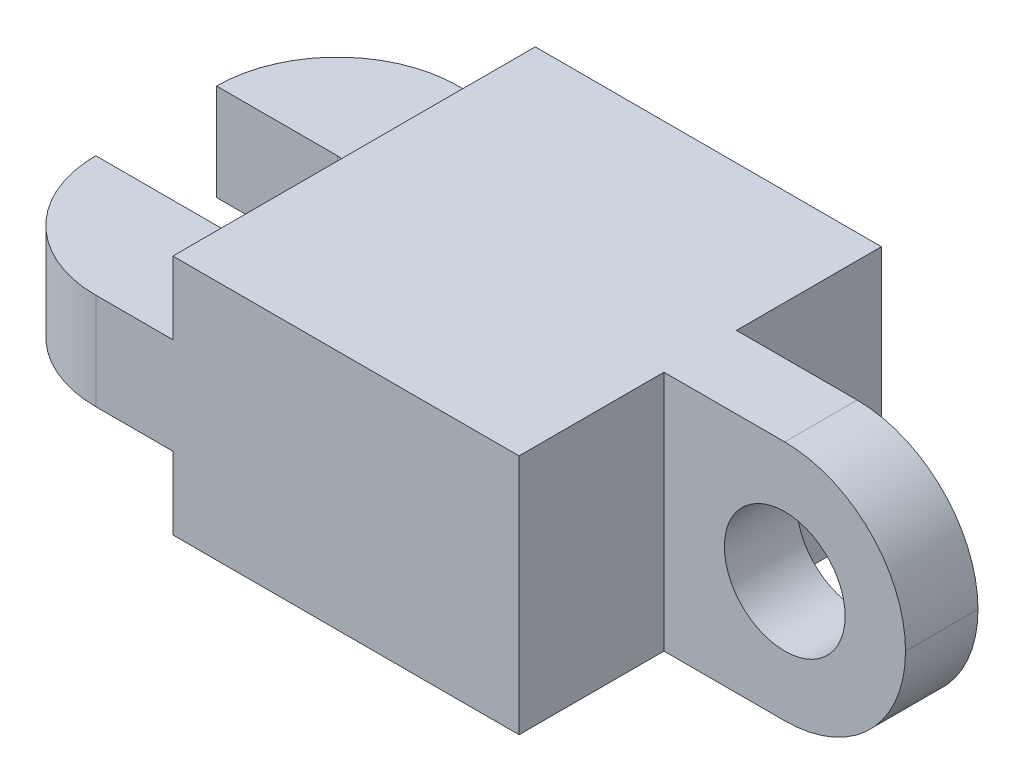
ISO-10303-21;
HEADER;
FILE_DESCRIPTION(('STEP AP214'),'2;1');
FILE_NAME('part.step','',(''),(''),'','','');
FILE_SCHEMA(('AUTOMOTIVE_DESIGN { 1 0 10303 214 1 1 1 1 }'));
ENDSEC;
DATA;
#1=APPLICATION_CONTEXT('core data for automotive mechanical design processes');
#2=APPLICATION_PROTOCOL_DEFINITION('international standard','automotive_design',2000,#1);
#3=PRODUCT_CONTEXT('',#1,'mechanical');
#4=PRODUCT('Part','Part','',(#3));
#5=PRODUCT_RELATED_PRODUCT_CATEGORY('part','',(#4));
#6=PRODUCT_DEFINITION_FORMATION('','',#4);
#7=PRODUCT_DEFINITION_CONTEXT('part definition',#1,'design');
#8=PRODUCT_DEFINITION('design','',#6,#7);
#9=PRODUCT_DEFINITION_SHAPE('','',#8);
#10=(LENGTH_UNIT() NAMED_UNIT(*) SI_UNIT(.MILLI.,.METRE.));
#11=(NAMED_UNIT(*) PLANE_ANGLE_UNIT() SI_UNIT($,.RADIAN.));
#12=(NAMED_UNIT(*) SI_UNIT($,.STERADIAN.) SOLID_ANGLE_UNIT());
#13=UNCERTAINTY_MEASURE_WITH_UNIT(LENGTH_MEASURE(1.E-05),#10,'distance_accuracy_value','');
#14=(GEOMETRIC_REPRESENTATION_CONTEXT(3) GLOBAL_UNCERTAINTY_ASSIGNED_CONTEXT((#13)) GLOBAL_UNIT_ASSIGNED_CONTEXT((#10,
#11,#12)) REPRESENTATION_CONTEXT('',''));
#15=CARTESIAN_POINT('',(0.,0.,0.));
#16=DIRECTION('',(0.,0.,1.));
#17=DIRECTION('',(1.,0.,0.));
#18=AXIS2_PLACEMENT_3D('',#15,#16,#17);
#19=CARTESIAN_POINT('',(0.,-50.,25.));
#20=DIRECTION('',(0.,1.,0.));
#21=DIRECTION('',(0.,0.,1.));
#22=AXIS2_PLACEMENT_3D('',#19,#20,#21);
#23=CYLINDRICAL_SURFACE('',#22,50.);
#24=DIRECTION('',(0.,1.,0.));
#25=VECTOR('',#24,1.);
#26=CARTESIAN_POINT('',(0.,-50.,75.));
#27=LINE('',#26,#25);
#28=CARTESIAN_POINT('',(0.,-20.,75.));
#29=VERTEX_POINT('',#28);
#30=CARTESIAN_POINT('',(0.,20.,75.));
#31=VERTEX_POINT('',#30);
#32=EDGE_CURVE('E300',#29,#31,#27,.T.);
#33=ORIENTED_EDGE('',*,*,#32,.T.);
#34=CARTESIAN_POINT('',(0.,20.,25.));
#35=DIRECTION('',(0.,1.,0.));
#36=DIRECTION('',(-1.,0.,0.));
#37=AXIS2_PLACEMENT_3D('',#34,#35,#36);
#38=CIRCLE('',#37,50.);
#39=CARTESIAN_POINT('',(-50.,20.,25.));
#40=VERTEX_POINT('',#39);
#41=EDGE_CURVE('E178',#31,#40,#38,.F.);
#42=ORIENTED_EDGE('',*,*,#41,.T.);
#43=DIRECTION('',(0.,1.,0.));
#44=VECTOR('',#43,1.);
#45=CARTESIAN_POINT('',(-50.,-50.,25.));
#46=LINE('',#45,#44);
#47=CARTESIAN_POINT('',(-50.,-20.,25.));
#48=VERTEX_POINT('',#47);
#49=EDGE_CURVE('E301',#48,#40,#46,.T.);
#50=ORIENTED_EDGE('',*,*,#49,.F.);
#51=CARTESIAN_POINT('',(0.,-20.,25.));
#52=DIRECTION('',(0.,-1.,0.));
#53=DIRECTION('',(1.,0.,0.));
#54=AXIS2_PLACEMENT_3D('',#51,#52,#53);
#55=CIRCLE('',#54,50.);
#56=EDGE_CURVE('E235',#48,#29,#55,.F.);
#57=ORIENTED_EDGE('',*,*,#56,.T.);
#58=EDGE_LOOP('',(#33,#42,#50,#57));
#59=FACE_BOUND('',#58,.T.);
#60=ADVANCED_FACE('F45',(#59),#23,.T.);
#61=CARTESIAN_POINT('',(-50.,-50.,25.));
#62=DIRECTION('',(0.,0.,-1.));
#63=DIRECTION('',(-1.,0.,0.));
#64=AXIS2_PLACEMENT_3D('',#61,#62,#63);
#65=PLANE('',#64);
#66=ORIENTED_EDGE('',*,*,#49,.T.);
#67=DIRECTION('',(1.,0.,0.));
#68=VECTOR('',#67,1.);
#69=CARTESIAN_POINT('',(-50.,20.,25.));
#70=LINE('',#69,#68);
#71=CARTESIAN_POINT('',(0.,20.,25.));
#72=VERTEX_POINT('',#71);
#73=EDGE_CURVE('E251',#40,#72,#70,.T.);
#74=ORIENTED_EDGE('',*,*,#73,.T.);
#75=DIRECTION('',(0.,1.,0.));
#76=VECTOR('',#75,1.);
#77=CARTESIAN_POINT('',(0.,-50.,25.));
#78=LINE('',#77,#76);
#79=CARTESIAN_POINT('',(0.,-20.,25.));
#80=VERTEX_POINT('',#79);
#81=EDGE_CURVE('E306',#80,#72,#78,.T.);
#82=ORIENTED_EDGE('',*,*,#81,.F.);
#83=DIRECTION('',(-1.,0.,0.));
#84=VECTOR('',#83,1.);
#85=CARTESIAN_POINT('',(-50.,-20.,25.));
#86=LINE('',#85,#84);
#87=EDGE_CURVE('E231',#80,#48,#86,.T.);
#88=ORIENTED_EDGE('',*,*,#87,.T.);
#89=EDGE_LOOP('',(#66,#74,#82,#88));
#90=FACE_BOUND('',#89,.T.);
#91=ADVANCED_FACE('F402',(#90),#65,.T.);
#92=CARTESIAN_POINT('',(0.,-50.,0.));
#93=DIRECTION('',(0.,1.,0.));
#94=DIRECTION('',(0.,0.,1.));
#95=AXIS2_PLACEMENT_3D('',#92,#93,#94);
#96=CYLINDRICAL_SURFACE('',#95,25.);
#97=ORIENTED_EDGE('',*,*,#81,.T.);
#98=CARTESIAN_POINT('',(0.,20.,0.));
#99=DIRECTION('',(0.,1.,0.));
#100=DIRECTION('',(-1.,0.,0.));
#101=AXIS2_PLACEMENT_3D('',#98,#99,#100);
#102=CIRCLE('',#101,25.);
#103=CARTESIAN_POINT('',(0.,20.,-25.));
#104=VERTEX_POINT('',#103);
#105=EDGE_CURVE('E247',#72,#104,#102,.T.);
#106=ORIENTED_EDGE('',*,*,#105,.T.);
#107=DIRECTION('',(0.,1.,0.));
#108=VECTOR('',#107,1.);
#109=CARTESIAN_POINT('',(0.,-50.,-25.));
#110=LINE('',#109,#108);
#111=CARTESIAN_POINT('',(0.,-20.,-25.));
#112=VERTEX_POINT('',#111);
#113=EDGE_CURVE('E310',#112,#104,#110,.T.);
#114=ORIENTED_EDGE('',*,*,#113,.F.);
#115=CARTESIAN_POINT('',(0.,-20.,0.));
#116=DIRECTION('',(0.,-1.,0.));
#117=DIRECTION('',(1.,0.,0.));
#118=AXIS2_PLACEMENT_3D('',#115,#116,#117);
#119=CIRCLE('',#118,25.);
#120=EDGE_CURVE('E227',#112,#80,#119,.T.);
#121=ORIENTED_EDGE('',*,*,#120,.T.);
#122=EDGE_LOOP('',(#97,#106,#114,#121));
#123=FACE_BOUND('',#122,.T.);
#124=ADVANCED_FACE('F399',(#123),#96,.F.);
#125=CARTESIAN_POINT('',(0.,-50.,-25.));
#126=DIRECTION('',(0.,0.,1.));
#127=DIRECTION('',(1.,0.,0.));
#128=AXIS2_PLACEMENT_3D('',#125,#126,#127);
#129=PLANE('',#128);
#130=ORIENTED_EDGE('',*,*,#113,.T.);
#131=DIRECTION('',(-1.,0.,0.));
#132=VECTOR('',#131,1.);
#133=CARTESIAN_POINT('',(0.,20.,-25.));
#134=LINE('',#133,#132);
#135=CARTESIAN_POINT('',(-50.,20.,-25.));
#136=VERTEX_POINT('',#135);
#137=EDGE_CURVE('E243',#104,#136,#134,.T.);
#138=ORIENTED_EDGE('',*,*,#137,.T.);
#139=DIRECTION('',(0.,1.,0.));
#140=VECTOR('',#139,1.);
#141=CARTESIAN_POINT('',(-50.,-50.,-25.));
#142=LINE('',#141,#140);
#143=CARTESIAN_POINT('',(-50.,-20.,-25.));
#144=VERTEX_POINT('',#143);
#145=EDGE_CURVE('E314',#144,#136,#142,.T.);
#146=ORIENTED_EDGE('',*,*,#145,.F.);
#147=DIRECTION('',(1.,0.,0.));
#148=VECTOR('',#147,1.);
#149=CARTESIAN_POINT('',(0.,-20.,-25.));
#150=LINE('',#149,#148);
#151=EDGE_CURVE('E223',#144,#112,#150,.T.);
#152=ORIENTED_EDGE('',*,*,#151,.T.);
#153=EDGE_LOOP('',(#130,#138,#146,#152));
#154=FACE_BOUND('',#153,.T.);
#155=ADVANCED_FACE('F396',(#154),#129,.T.);
#156=CARTESIAN_POINT('',(0.,-50.,-25.));
#157=DIRECTION('',(0.,1.,0.));
#158=DIRECTION('',(0.,0.,1.));
#159=AXIS2_PLACEMENT_3D('',#156,#157,#158);
#160=CYLINDRICAL_SURFACE('',#159,50.);
#161=ORIENTED_EDGE('',*,*,#145,.T.);
#162=CARTESIAN_POINT('',(0.,20.,-25.));
#163=DIRECTION('',(0.,1.,0.));
#164=DIRECTION('',(-1.,0.,0.));
#165=AXIS2_PLACEMENT_3D('',#162,#163,#164);
#166=CIRCLE('',#165,50.);
#167=CARTESIAN_POINT('',(0.,20.,-75.));
#168=VERTEX_POINT('',#167);
#169=EDGE_CURVE('E239',#136,#168,#166,.F.);
#170=ORIENTED_EDGE('',*,*,#169,.T.);
#171=DIRECTION('',(0.,1.,0.));
#172=VECTOR('',#171,1.);
#173=CARTESIAN_POINT('',(0.,-50.,-75.));
#174=LINE('',#173,#172);
#175=CARTESIAN_POINT('',(0.,-20.,-75.));
#176=VERTEX_POINT('',#175);
#177=EDGE_CURVE('E318',#176,#168,#174,.T.);
#178=ORIENTED_EDGE('',*,*,#177,.F.);
#179=CARTESIAN_POINT('',(0.,-20.,-25.));
#180=DIRECTION('',(0.,-1.,0.));
#181=DIRECTION('',(1.,0.,0.));
#182=AXIS2_PLACEMENT_3D('',#179,#180,#181);
#183=CIRCLE('',#182,50.);
#184=EDGE_CURVE('E200',#176,#144,#183,.F.);
#185=ORIENTED_EDGE('',*,*,#184,.T.);
#186=EDGE_LOOP('',(#161,#170,#178,#185));
#187=FACE_BOUND('',#186,.T.);
#188=ADVANCED_FACE('F393',(#187),#160,.T.);
#189=CARTESIAN_POINT('',(0.,-50.,-75.));
#190=DIRECTION('',(0.,0.,-1.));
#191=DIRECTION('',(-1.,0.,0.));
#192=AXIS2_PLACEMENT_3D('',#189,#190,#191);
#193=PLANE('',#192);
#194=ORIENTED_EDGE('',*,*,#177,.T.);
#195=DIRECTION('',(-1.,0.,0.));
#196=VECTOR('',#195,1.);
#197=CARTESIAN_POINT('',(0.,20.,-75.));
#198=LINE('',#197,#196);
#199=CARTESIAN_POINT('',(31.9199581451702,20.,-75.));
#200=VERTEX_POINT('',#199);
#201=EDGE_CURVE('E190',#200,#168,#198,.T.);
#202=ORIENTED_EDGE('',*,*,#201,.F.);
#203=DIRECTION('',(0.,-1.,0.));
#204=VECTOR('',#203,1.);
#205=CARTESIAN_POINT('',(31.9199581451702,50.,-75.));
#206=LINE('',#205,#204);
#207=CARTESIAN_POINT('',(31.9199581451702,50.,-75.));
#208=VERTEX_POINT('',#207);
#209=EDGE_CURVE('E168',#208,#200,#206,.T.);
#210=ORIENTED_EDGE('',*,*,#209,.F.);
#211=DIRECTION('',(-1.,0.,0.));
#212=VECTOR('',#211,1.);
#213=CARTESIAN_POINT('',(0.,50.,-75.));
#214=LINE('',#213,#212);
#215=CARTESIAN_POINT('',(175.21995814517,50.,-75.));
#216=VERTEX_POINT('',#215);
#217=EDGE_CURVE('E274',#216,#208,#214,.T.);
#218=ORIENTED_EDGE('',*,*,#217,.F.);
#219=DIRECTION('',(0.,1.,0.));
#220=VECTOR('',#219,1.);
#221=CARTESIAN_POINT('',(175.21995814517,-50.,-75.));
#222=LINE('',#221,#220);
#223=CARTESIAN_POINT('',(175.21995814517,-50.,-75.));
#224=VERTEX_POINT('',#223);
#225=EDGE_CURVE('E322',#224,#216,#222,.T.);
#226=ORIENTED_EDGE('',*,*,#225,.F.);
#227=DIRECTION('',(-1.,0.,0.));
#228=VECTOR('',#227,1.);
#229=CARTESIAN_POINT('',(0.,-50.,-75.));
#230=LINE('',#229,#228);
#231=CARTESIAN_POINT('',(31.9199581451702,-50.,-75.));
#232=VERTEX_POINT('',#231);
#233=EDGE_CURVE('E296',#224,#232,#230,.T.);
#234=ORIENTED_EDGE('',*,*,#233,.T.);
#235=DIRECTION('',(0.,-1.,0.));
#236=VECTOR('',#235,1.);
#237=CARTESIAN_POINT('',(31.9199581451702,-20.,-75.));
#238=LINE('',#237,#236);
#239=CARTESIAN_POINT('',(31.9199581451702,-20.,-75.));
#240=VERTEX_POINT('',#239);
#241=EDGE_CURVE('E62',#240,#232,#238,.T.);
#242=ORIENTED_EDGE('',*,*,#241,.F.);
#243=DIRECTION('',(1.,0.,0.));
#244=VECTOR('',#243,1.);
#245=CARTESIAN_POINT('',(0.,-20.,-75.));
#246=LINE('',#245,#244);
#247=EDGE_CURVE('E210',#176,#240,#246,.T.);
#248=ORIENTED_EDGE('',*,*,#247,.F.);
#249=EDGE_LOOP('',(#194,#202,#210,#218,#226,#234,#242,#248));
#250=FACE_BOUND('',#249,.T.);
#251=ADVANCED_FACE('F385',(#250),#193,.T.);
#252=CARTESIAN_POINT('',(175.21995814517,-50.,75.));
#253=DIRECTION('',(0.,0.,1.));
#254=DIRECTION('',(1.,0.,0.));
#255=AXIS2_PLACEMENT_3D('',#252,#253,#254);
#256=PLANE('',#255);
#257=DIRECTION('',(0.,-1.,0.));
#258=VECTOR('',#257,1.);
#259=CARTESIAN_POINT('',(31.9199581451702,50.,75.));
#260=LINE('',#259,#258);
#261=CARTESIAN_POINT('',(31.9199581451702,50.,75.));
#262=VERTEX_POINT('',#261);
#263=CARTESIAN_POINT('',(31.9199581451702,20.,75.));
#264=VERTEX_POINT('',#263);
#265=EDGE_CURVE('E70',#262,#264,#260,.T.);
#266=ORIENTED_EDGE('',*,*,#265,.T.);
#267=DIRECTION('',(-1.,0.,0.));
#268=VECTOR('',#267,1.);
#269=CARTESIAN_POINT('',(0.,20.,75.));
#270=LINE('',#269,#268);
#271=EDGE_CURVE('E175',#264,#31,#270,.T.);
#272=ORIENTED_EDGE('',*,*,#271,.T.);
#273=ORIENTED_EDGE('',*,*,#32,.F.);
#274=DIRECTION('',(1.,0.,0.));
#275=VECTOR('',#274,1.);
#276=CARTESIAN_POINT('',(0.,-20.,75.));
#277=LINE('',#276,#275);
#278=CARTESIAN_POINT('',(31.9199581451702,-20.,75.));
#279=VERTEX_POINT('',#278);
#280=EDGE_CURVE('E183',#29,#279,#277,.T.);
#281=ORIENTED_EDGE('',*,*,#280,.T.);
#282=DIRECTION('',(0.,-1.,0.));
#283=VECTOR('',#282,1.);
#284=CARTESIAN_POINT('',(31.9199581451702,-20.,75.));
#285=LINE('',#284,#283);
#286=CARTESIAN_POINT('',(31.9199581451701,-50.,75.));
#287=VERTEX_POINT('',#286);
#288=EDGE_CURVE('E213',#279,#287,#285,.T.);
#289=ORIENTED_EDGE('',*,*,#288,.T.);
#290=DIRECTION('',(1.,0.,0.));
#291=VECTOR('',#290,1.);
#292=CARTESIAN_POINT('',(175.21995814517,-50.,75.));
#293=LINE('',#292,#291);
#294=CARTESIAN_POINT('',(175.21995814517,-50.,75.));
#295=VERTEX_POINT('',#294);
#296=EDGE_CURVE('E278',#287,#295,#293,.T.);
#297=ORIENTED_EDGE('',*,*,#296,.T.);
#298=DIRECTION('',(0.,1.,0.));
#299=VECTOR('',#298,1.);
#300=CARTESIAN_POINT('',(175.21995814517,-50.,75.));
#301=LINE('',#300,#299);
#302=CARTESIAN_POINT('',(175.21995814517,50.,75.));
#303=VERTEX_POINT('',#302);
#304=EDGE_CURVE('E332',#295,#303,#301,.T.);
#305=ORIENTED_EDGE('',*,*,#304,.T.);
#306=DIRECTION('',(1.,0.,0.));
#307=VECTOR('',#306,1.);
#308=CARTESIAN_POINT('',(175.21995814517,50.,75.));
#309=LINE('',#308,#307);
#310=EDGE_CURVE('E188',#262,#303,#309,.T.);
#311=ORIENTED_EDGE('',*,*,#310,.F.);
#312=EDGE_LOOP('',(#266,#272,#273,#281,#289,#297,#305,#311));
#313=FACE_BOUND('',#312,.T.);
#314=ADVANCED_FACE('F186',(#313),#256,.T.);
#315=CARTESIAN_POINT('',(0.,-50.,25.));
#316=DIRECTION('',(0.,-1.,0.));
#317=DIRECTION('',(0.,0.,-1.));
#318=AXIS2_PLACEMENT_3D('',#315,#316,#317);
#319=PLANE('',#318);
#320=ORIENTED_EDGE('',*,*,#296,.F.);
#321=DIRECTION('',(0.,0.,1.));
#322=VECTOR('',#321,1.);
#323=CARTESIAN_POINT('',(31.9199581451701,-50.,-75.));
#324=LINE('',#323,#322);
#325=EDGE_CURVE('E204',#232,#287,#324,.T.);
#326=ORIENTED_EDGE('',*,*,#325,.F.);
#327=ORIENTED_EDGE('',*,*,#233,.F.);
#328=DIRECTION('',(0.,0.,-1.));
#329=VECTOR('',#328,1.);
#330=CARTESIAN_POINT('',(175.21995814517,-50.,-75.));
#331=LINE('',#330,#329);
#332=CARTESIAN_POINT('',(175.21995814517,-50.,-15.));
#333=VERTEX_POINT('',#332);
#334=EDGE_CURVE('E292',#333,#224,#331,.T.);
#335=ORIENTED_EDGE('',*,*,#334,.F.);
#336=DIRECTION('',(-1.,0.,0.));
#337=VECTOR('',#336,1.);
#338=CARTESIAN_POINT('',(175.21995814517,-50.,-15.));
#339=LINE('',#338,#337);
#340=CARTESIAN_POINT('',(225.21995814517,-50.,-15.));
#341=VERTEX_POINT('',#340);
#342=EDGE_CURVE('E289',#341,#333,#339,.T.);
#343=ORIENTED_EDGE('',*,*,#342,.F.);
#344=DIRECTION('',(0.,0.,-1.));
#345=VECTOR('',#344,1.);
#346=CARTESIAN_POINT('',(225.21995814517,-50.,25.));
#347=LINE('',#346,#345);
#348=CARTESIAN_POINT('',(225.21995814517,-50.,15.));
#349=VERTEX_POINT('',#348);
#350=EDGE_CURVE('E11',#341,#349,#347,.F.);
#351=ORIENTED_EDGE('',*,*,#350,.T.);
#352=DIRECTION('',(1.,0.,0.));
#353=VECTOR('',#352,1.);
#354=CARTESIAN_POINT('',(275.21995814517,-50.,15.));
#355=LINE('',#354,#353);
#356=CARTESIAN_POINT('',(175.21995814517,-50.,15.));
#357=VERTEX_POINT('',#356);
#358=EDGE_CURVE('E285',#357,#349,#355,.T.);
#359=ORIENTED_EDGE('',*,*,#358,.F.);
#360=DIRECTION('',(0.,0.,-1.));
#361=VECTOR('',#360,1.);
#362=CARTESIAN_POINT('',(175.21995814517,-50.,15.));
#363=LINE('',#362,#361);
#364=EDGE_CURVE('E281',#295,#357,#363,.T.);
#365=ORIENTED_EDGE('',*,*,#364,.F.);
#366=EDGE_LOOP('',(#320,#326,#327,#335,#343,#351,#359,#365));
#367=FACE_BOUND('',#366,.T.);
#368=ADVANCED_FACE('F373',(#367),#319,.T.);
#369=CARTESIAN_POINT('',(0.,50.,25.));
#370=DIRECTION('',(0.,-1.,0.));
#371=DIRECTION('',(0.,0.,-1.));
#372=AXIS2_PLACEMENT_3D('',#369,#370,#371);
#373=PLANE('',#372);
#374=DIRECTION('',(0.,0.,1.));
#375=VECTOR('',#374,1.);
#376=CARTESIAN_POINT('',(31.9199581451702,50.,-75.));
#377=LINE('',#376,#375);
#378=EDGE_CURVE('E172',#208,#262,#377,.T.);
#379=ORIENTED_EDGE('',*,*,#378,.T.);
#380=ORIENTED_EDGE('',*,*,#310,.T.);
#381=DIRECTION('',(0.,0.,-1.));
#382=VECTOR('',#381,1.);
#383=CARTESIAN_POINT('',(175.21995814517,50.,15.));
#384=LINE('',#383,#382);
#385=CARTESIAN_POINT('',(175.21995814517,50.,15.));
#386=VERTEX_POINT('',#385);
#387=EDGE_CURVE('E259',#303,#386,#384,.T.);
#388=ORIENTED_EDGE('',*,*,#387,.T.);
#389=DIRECTION('',(1.,0.,0.));
#390=VECTOR('',#389,1.);
#391=CARTESIAN_POINT('',(275.21995814517,50.,15.));
#392=LINE('',#391,#390);
#393=CARTESIAN_POINT('',(225.21995814517,50.,15.));
#394=VERTEX_POINT('',#393);
#395=EDGE_CURVE('E263',#386,#394,#392,.T.);
#396=ORIENTED_EDGE('',*,*,#395,.T.);
#397=DIRECTION('',(0.,0.,-1.));
#398=VECTOR('',#397,1.);
#399=CARTESIAN_POINT('',(225.21995814517,50.,-15.));
#400=LINE('',#399,#398);
#401=CARTESIAN_POINT('',(225.21995814517,50.,-15.));
#402=VERTEX_POINT('',#401);
#403=EDGE_CURVE('E305',#394,#402,#400,.T.);
#404=ORIENTED_EDGE('',*,*,#403,.T.);
#405=DIRECTION('',(-1.,0.,0.));
#406=VECTOR('',#405,1.);
#407=CARTESIAN_POINT('',(175.21995814517,50.,-15.));
#408=LINE('',#407,#406);
#409=CARTESIAN_POINT('',(175.21995814517,50.,-15.));
#410=VERTEX_POINT('',#409);
#411=EDGE_CURVE('E267',#402,#410,#408,.T.);
#412=ORIENTED_EDGE('',*,*,#411,.T.);
#413=DIRECTION('',(0.,0.,-1.));
#414=VECTOR('',#413,1.);
#415=CARTESIAN_POINT('',(175.21995814517,50.,-75.));
#416=LINE('',#415,#414);
#417=EDGE_CURVE('E270',#410,#216,#416,.T.);
#418=ORIENTED_EDGE('',*,*,#417,.T.);
#419=ORIENTED_EDGE('',*,*,#217,.T.);
#420=EDGE_LOOP('',(#379,#380,#388,#396,#404,#412,#418,#419));
#421=FACE_BOUND('',#420,.T.);
#422=ADVANCED_FACE('F360',(#421),#373,.F.);
#423=CARTESIAN_POINT('',(175.21995814517,-50.,-75.));
#424=DIRECTION('',(1.,0.,0.));
#425=DIRECTION('',(0.,0.,-1.));
#426=AXIS2_PLACEMENT_3D('',#423,#424,#425);
#427=PLANE('',#426);
#428=ORIENTED_EDGE('',*,*,#225,.T.);
#429=ORIENTED_EDGE('',*,*,#417,.F.);
#430=DIRECTION('',(0.,1.,0.));
#431=VECTOR('',#430,1.);
#432=CARTESIAN_POINT('',(175.21995814517,-50.,-15.));
#433=LINE('',#432,#431);
#434=EDGE_CURVE('E325',#333,#410,#433,.T.);
#435=ORIENTED_EDGE('',*,*,#434,.F.);
#436=ORIENTED_EDGE('',*,*,#334,.T.);
#437=EDGE_LOOP('',(#428,#429,#435,#436));
#438=FACE_BOUND('',#437,.T.);
#439=ADVANCED_FACE('F390',(#438),#427,.T.);
#440=CARTESIAN_POINT('',(175.21995814517,-50.,-15.));
#441=DIRECTION('',(0.,0.,-1.));
#442=DIRECTION('',(-1.,0.,0.));
#443=AXIS2_PLACEMENT_3D('',#440,#441,#442);
#444=PLANE('',#443);
#445=CARTESIAN_POINT('',(225.21995814517,0.,-15.));
#446=DIRECTION('',(0.,0.,-1.));
#447=DIRECTION('',(-1.,0.,0.));
#448=AXIS2_PLACEMENT_3D('',#445,#446,#447);
#449=CIRCLE('',#448,25.);
#450=CARTESIAN_POINT('',(200.21995814517,0.,-15.));
#451=VERTEX_POINT('',#450);
#452=EDGE_CURVE('E579',#451,#451,#449,.T.);
#453=ORIENTED_EDGE('',*,*,#452,.F.);
#454=EDGE_LOOP('',(#453));
#455=FACE_BOUND('',#454,.T.);
#456=ORIENTED_EDGE('',*,*,#411,.F.);
#457=CARTESIAN_POINT('',(225.21995814517,0.,-15.));
#458=DIRECTION('',(0.,0.,-1.));
#459=DIRECTION('',(-1.,0.,0.));
#460=AXIS2_PLACEMENT_3D('',#457,#458,#459);
#461=CIRCLE('',#460,50.);
#462=CARTESIAN_POINT('',(275.21995814517,0.,-15.));
#463=VERTEX_POINT('',#462);
#464=EDGE_CURVE('E343',#402,#463,#461,.T.);
#465=ORIENTED_EDGE('',*,*,#464,.T.);
#466=CARTESIAN_POINT('',(225.21995814517,0.,-15.));
#467=DIRECTION('',(0.,0.,-1.));
#468=DIRECTION('',(-1.,0.,0.));
#469=AXIS2_PLACEMENT_3D('',#466,#467,#468);
#470=CIRCLE('',#469,50.);
#471=EDGE_CURVE('E340',#463,#341,#470,.T.);
#472=ORIENTED_EDGE('',*,*,#471,.T.);
#473=ORIENTED_EDGE('',*,*,#342,.T.);
#474=ORIENTED_EDGE('',*,*,#434,.T.);
#475=EDGE_LOOP('',(#456,#465,#472,#473,#474));
#476=FACE_BOUND('',#475,.T.);
#477=ADVANCED_FACE('F366',(#455,#476),#444,.T.);
#478=CARTESIAN_POINT('',(275.21995814517,-50.,15.));
#479=DIRECTION('',(0.,0.,1.));
#480=DIRECTION('',(1.,0.,0.));
#481=AXIS2_PLACEMENT_3D('',#478,#479,#480);
#482=PLANE('',#481);
#483=CARTESIAN_POINT('',(225.21995814517,0.,15.));
#484=DIRECTION('',(0.,0.,1.));
#485=DIRECTION('',(1.,0.,0.));
#486=AXIS2_PLACEMENT_3D('',#483,#484,#485);
#487=CIRCLE('',#486,25.);
#488=CARTESIAN_POINT('',(250.21995814517,0.,15.));
#489=VERTEX_POINT('',#488);
#490=EDGE_CURVE('E205',#489,#489,#487,.T.);
#491=ORIENTED_EDGE('',*,*,#490,.F.);
#492=EDGE_LOOP('',(#491));
#493=FACE_BOUND('',#492,.T.);
#494=CARTESIAN_POINT('',(225.21995814517,0.,15.));
#495=DIRECTION('',(0.,0.,1.));
#496=DIRECTION('',(1.,0.,0.));
#497=AXIS2_PLACEMENT_3D('',#494,#495,#496);
#498=CIRCLE('',#497,50.);
#499=CARTESIAN_POINT('',(275.21995814517,0.,15.));
#500=VERTEX_POINT('',#499);
#501=EDGE_CURVE('E346',#349,#500,#498,.T.);
#502=ORIENTED_EDGE('',*,*,#501,.T.);
#503=CARTESIAN_POINT('',(225.21995814517,0.,15.));
#504=DIRECTION('',(0.,0.,1.));
#505=DIRECTION('',(1.,0.,0.));
#506=AXIS2_PLACEMENT_3D('',#503,#504,#505);
#507=CIRCLE('',#506,50.);
#508=EDGE_CURVE('E55',#500,#394,#507,.T.);
#509=ORIENTED_EDGE('',*,*,#508,.T.);
#510=ORIENTED_EDGE('',*,*,#395,.F.);
#511=DIRECTION('',(0.,1.,0.));
#512=VECTOR('',#511,1.);
#513=CARTESIAN_POINT('',(175.21995814517,-50.,15.));
#514=LINE('',#513,#512);
#515=EDGE_CURVE('E329',#357,#386,#514,.T.);
#516=ORIENTED_EDGE('',*,*,#515,.F.);
#517=ORIENTED_EDGE('',*,*,#358,.T.);
#518=EDGE_LOOP('',(#502,#509,#510,#516,#517));
#519=FACE_BOUND('',#518,.T.);
#520=ADVANCED_FACE('F353',(#493,#519),#482,.T.);
#521=CARTESIAN_POINT('',(175.21995814517,-50.,15.));
#522=DIRECTION('',(1.,0.,0.));
#523=DIRECTION('',(0.,0.,-1.));
#524=AXIS2_PLACEMENT_3D('',#521,#522,#523);
#525=PLANE('',#524);
#526=ORIENTED_EDGE('',*,*,#515,.T.);
#527=ORIENTED_EDGE('',*,*,#387,.F.);
#528=ORIENTED_EDGE('',*,*,#304,.F.);
#529=ORIENTED_EDGE('',*,*,#364,.T.);
#530=EDGE_LOOP('',(#526,#527,#528,#529));
#531=FACE_BOUND('',#530,.T.);
#532=ADVANCED_FACE('F377',(#531),#525,.T.);
#533=CARTESIAN_POINT('',(225.21995814517,0.,-15.));
#534=DIRECTION('',(0.,0.,-1.));
#535=DIRECTION('',(-1.,0.,0.));
#536=AXIS2_PLACEMENT_3D('',#533,#534,#535);
#537=CYLINDRICAL_SURFACE('',#536,50.);
#538=DIRECTION('',(0.,0.,-1.));
#539=VECTOR('',#538,1.);
#540=CARTESIAN_POINT('',(275.21995814517,0.,-15.));
#541=LINE('',#540,#539);
#542=EDGE_CURVE('E49',#500,#463,#541,.T.);
#543=ORIENTED_EDGE('',*,*,#542,.F.);
#544=ORIENTED_EDGE('',*,*,#501,.F.);
#545=ORIENTED_EDGE('',*,*,#350,.F.);
#546=ORIENTED_EDGE('',*,*,#471,.F.);
#547=EDGE_LOOP('',(#543,#544,#545,#546));
#548=FACE_BOUND('',#547,.T.);
#549=ADVANCED_FACE('F47',(#548),#537,.T.);
#550=CARTESIAN_POINT('',(225.21995814517,0.,25.));
#551=DIRECTION('',(0.,0.,1.));
#552=DIRECTION('',(1.,0.,0.));
#553=AXIS2_PLACEMENT_3D('',#550,#551,#552);
#554=CYLINDRICAL_SURFACE('',#553,50.);
#555=ORIENTED_EDGE('',*,*,#508,.F.);
#556=ORIENTED_EDGE('',*,*,#542,.T.);
#557=ORIENTED_EDGE('',*,*,#464,.F.);
#558=ORIENTED_EDGE('',*,*,#403,.F.);
#559=EDGE_LOOP('',(#555,#556,#557,#558));
#560=FACE_BOUND('',#559,.T.);
#561=ADVANCED_FACE('F363',(#560),#554,.T.);
#562=CARTESIAN_POINT('',(0.,20.,-75.));
#563=DIRECTION('',(0.,1.,0.));
#564=DIRECTION('',(-1.,0.,0.));
#565=AXIS2_PLACEMENT_3D('',#562,#563,#564);
#566=PLANE('',#565);
#567=ORIENTED_EDGE('',*,*,#271,.F.);
#568=DIRECTION('',(0.,0.,1.));
#569=VECTOR('',#568,1.);
#570=CARTESIAN_POINT('',(31.9199581451702,20.,-75.));
#571=LINE('',#570,#569);
#572=EDGE_CURVE('E164',#200,#264,#571,.T.);
#573=ORIENTED_EDGE('',*,*,#572,.F.);
#574=ORIENTED_EDGE('',*,*,#201,.T.);
#575=ORIENTED_EDGE('',*,*,#169,.F.);
#576=ORIENTED_EDGE('',*,*,#137,.F.);
#577=ORIENTED_EDGE('',*,*,#105,.F.);
#578=ORIENTED_EDGE('',*,*,#73,.F.);
#579=ORIENTED_EDGE('',*,*,#41,.F.);
#580=EDGE_LOOP('',(#567,#573,#574,#575,#576,#577,#578,#579));
#581=FACE_BOUND('',#580,.T.);
#582=ADVANCED_FACE('F176',(#581),#566,.T.);
#583=CARTESIAN_POINT('',(31.9199581451702,50.,-75.));
#584=DIRECTION('',(-1.,0.,0.));
#585=DIRECTION('',(0.,-1.,0.));
#586=AXIS2_PLACEMENT_3D('',#583,#584,#585);
#587=PLANE('',#586);
#588=ORIENTED_EDGE('',*,*,#378,.F.);
#589=ORIENTED_EDGE('',*,*,#209,.T.);
#590=ORIENTED_EDGE('',*,*,#572,.T.);
#591=ORIENTED_EDGE('',*,*,#265,.F.);
#592=EDGE_LOOP('',(#588,#589,#590,#591));
#593=FACE_BOUND('',#592,.T.);
#594=ADVANCED_FACE('F166',(#593),#587,.T.);
#595=CARTESIAN_POINT('',(0.,-20.,-75.));
#596=DIRECTION('',(0.,-1.,0.));
#597=DIRECTION('',(1.,0.,0.));
#598=AXIS2_PLACEMENT_3D('',#595,#596,#597);
#599=PLANE('',#598);
#600=ORIENTED_EDGE('',*,*,#87,.F.);
#601=ORIENTED_EDGE('',*,*,#120,.F.);
#602=ORIENTED_EDGE('',*,*,#151,.F.);
#603=ORIENTED_EDGE('',*,*,#184,.F.);
#604=ORIENTED_EDGE('',*,*,#247,.T.);
#605=DIRECTION('',(0.,0.,1.));
#606=VECTOR('',#605,1.);
#607=CARTESIAN_POINT('',(31.9199581451702,-20.,-75.));
#608=LINE('',#607,#606);
#609=EDGE_CURVE('E201',#240,#279,#608,.T.);
#610=ORIENTED_EDGE('',*,*,#609,.T.);
#611=ORIENTED_EDGE('',*,*,#280,.F.);
#612=ORIENTED_EDGE('',*,*,#56,.F.);
#613=EDGE_LOOP('',(#600,#601,#602,#603,#604,#610,#611,#612));
#614=FACE_BOUND('',#613,.T.);
#615=ADVANCED_FACE('F405',(#614),#599,.T.);
#616=CARTESIAN_POINT('',(31.9199581451702,-20.,-75.));
#617=DIRECTION('',(-1.,0.,0.));
#618=DIRECTION('',(0.,-1.,0.));
#619=AXIS2_PLACEMENT_3D('',#616,#617,#618);
#620=PLANE('',#619);
#621=ORIENTED_EDGE('',*,*,#609,.F.);
#622=ORIENTED_EDGE('',*,*,#241,.T.);
#623=ORIENTED_EDGE('',*,*,#325,.T.);
#624=ORIENTED_EDGE('',*,*,#288,.F.);
#625=EDGE_LOOP('',(#621,#622,#623,#624));
#626=FACE_BOUND('',#625,.T.);
#627=ADVANCED_FACE('F381',(#626),#620,.T.);
#628=CARTESIAN_POINT('',(225.21995814517,0.,-15.));
#629=DIRECTION('',(0.,0.,-1.));
#630=DIRECTION('',(-1.,0.,0.));
#631=AXIS2_PLACEMENT_3D('',#628,#629,#630);
#632=CYLINDRICAL_SURFACE('',#631,25.);
#633=ORIENTED_EDGE('',*,*,#490,.T.);
#634=EDGE_LOOP('',(#633));
#635=FACE_BOUND('',#634,.T.);
#636=ORIENTED_EDGE('',*,*,#452,.T.);
#637=EDGE_LOOP('',(#636));
#638=FACE_BOUND('',#637,.T.);
#639=ADVANCED_FACE('F412',(#635,#638),#632,.F.);
#640=CLOSED_SHELL('',(#60,#91,#124,#155,#188,#251,#314,#368,#422,#439,#477,#520,#532,#549,#561,
#582,#594,#615,#627,#639));
#641=MANIFOLD_SOLID_BREP('B2',#640);
#642=ADVANCED_BREP_SHAPE_REPRESENTATION('',(#18,#641),#14);
#643=SHAPE_DEFINITION_REPRESENTATION(#9,#642);
ENDSEC;
END-ISO-10303-21;
